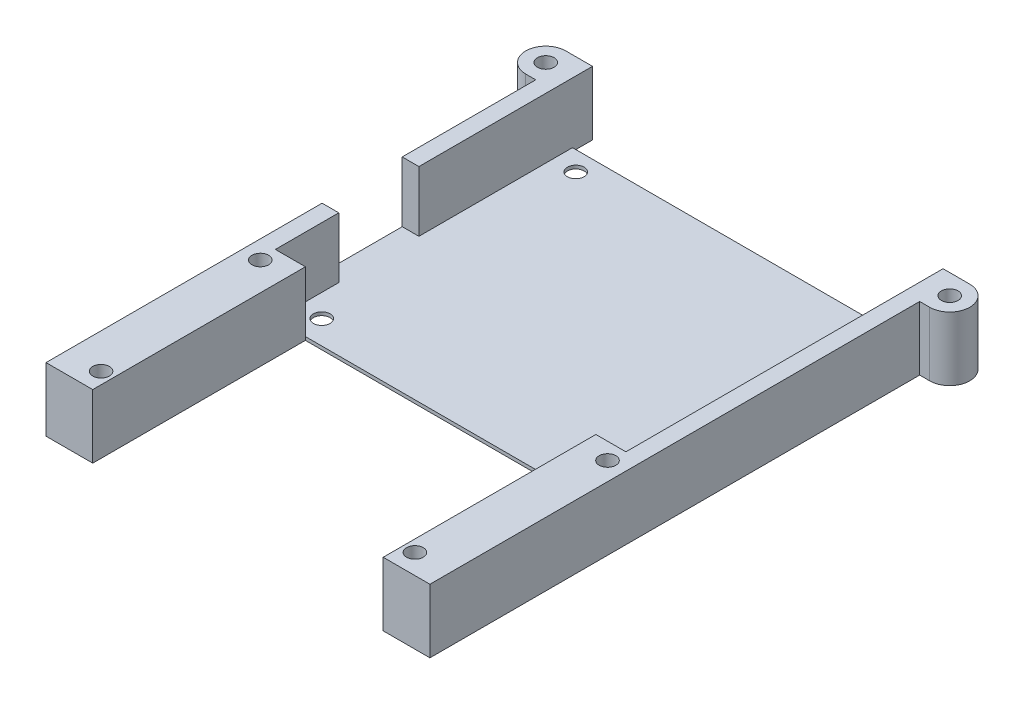
ISO-10303-21;
HEADER;
FILE_DESCRIPTION(('STEP AP214'),'2;1');
FILE_NAME('part.step','',(''),(''),'','','');
FILE_SCHEMA(('AUTOMOTIVE_DESIGN { 1 0 10303 214 1 1 1 1 }'));
ENDSEC;
DATA;
#1=APPLICATION_CONTEXT('core data for automotive mechanical design processes');
#2=APPLICATION_PROTOCOL_DEFINITION('international standard','automotive_design',2000,#1);
#3=PRODUCT_CONTEXT('',#1,'mechanical');
#4=PRODUCT('Part','Part','',(#3));
#5=PRODUCT_RELATED_PRODUCT_CATEGORY('part','',(#4));
#6=PRODUCT_DEFINITION_FORMATION('','',#4);
#7=PRODUCT_DEFINITION_CONTEXT('part definition',#1,'design');
#8=PRODUCT_DEFINITION('design','',#6,#7);
#9=PRODUCT_DEFINITION_SHAPE('','',#8);
#10=(LENGTH_UNIT() NAMED_UNIT(*) SI_UNIT(.MILLI.,.METRE.));
#11=(NAMED_UNIT(*) PLANE_ANGLE_UNIT() SI_UNIT($,.RADIAN.));
#12=(NAMED_UNIT(*) SI_UNIT($,.STERADIAN.) SOLID_ANGLE_UNIT());
#13=UNCERTAINTY_MEASURE_WITH_UNIT(LENGTH_MEASURE(1.E-05),#10,'distance_accuracy_value','');
#14=(GEOMETRIC_REPRESENTATION_CONTEXT(3) GLOBAL_UNCERTAINTY_ASSIGNED_CONTEXT((#13)) GLOBAL_UNIT_ASSIGNED_CONTEXT((#10,
#11,#12)) REPRESENTATION_CONTEXT('',''));
#15=CARTESIAN_POINT('',(0.,0.,0.));
#16=DIRECTION('',(0.,0.,1.));
#17=DIRECTION('',(1.,0.,0.));
#18=AXIS2_PLACEMENT_3D('',#15,#16,#17);
#19=CARTESIAN_POINT('',(0.,0.5,-31.85));
#20=DIRECTION('',(0.,0.,1.));
#21=DIRECTION('',(1.,0.,0.));
#22=AXIS2_PLACEMENT_3D('',#19,#20,#21);
#23=PLANE('',#22);
#24=DIRECTION('',(0.,-1.,0.));
#25=VECTOR('',#24,1.);
#26=CARTESIAN_POINT('',(21.75,9.55,-31.85));
#27=LINE('',#26,#25);
#28=CARTESIAN_POINT('',(21.75,0.5,-31.85));
#29=VERTEX_POINT('',#28);
#30=CARTESIAN_POINT('',(21.75,0.,-31.85));
#31=VERTEX_POINT('',#30);
#32=EDGE_CURVE('E335',#29,#31,#27,.T.);
#33=ORIENTED_EDGE('',*,*,#32,.F.);
#34=DIRECTION('',(-1.,0.,0.));
#35=VECTOR('',#34,1.);
#36=CARTESIAN_POINT('',(0.,0.5,-31.85));
#37=LINE('',#36,#35);
#38=CARTESIAN_POINT('',(-21.75,0.5,-31.85));
#39=VERTEX_POINT('',#38);
#40=EDGE_CURVE('E70',#29,#39,#37,.T.);
#41=ORIENTED_EDGE('',*,*,#40,.T.);
#42=DIRECTION('',(0.,-1.,0.));
#43=VECTOR('',#42,1.);
#44=CARTESIAN_POINT('',(-21.75,9.55,-31.85));
#45=LINE('',#44,#43);
#46=CARTESIAN_POINT('',(-21.75,0.,-31.85));
#47=VERTEX_POINT('',#46);
#48=EDGE_CURVE('E396',#39,#47,#45,.T.);
#49=ORIENTED_EDGE('',*,*,#48,.T.);
#50=DIRECTION('',(-1.,0.,0.));
#51=VECTOR('',#50,1.);
#52=CARTESIAN_POINT('',(0.,0.,-31.85));
#53=LINE('',#52,#51);
#54=EDGE_CURVE('E416',#31,#47,#53,.T.);
#55=ORIENTED_EDGE('',*,*,#54,.F.);
#56=EDGE_LOOP('',(#33,#41,#49,#55));
#57=FACE_BOUND('',#56,.T.);
#58=ADVANCED_FACE('F45',(#57),#23,.T.);
#59=CARTESIAN_POINT('',(0.,0.5,-76.35));
#60=DIRECTION('',(0.,0.,-1.));
#61=DIRECTION('',(-1.,0.,0.));
#62=AXIS2_PLACEMENT_3D('',#59,#60,#61);
#63=PLANE('',#62);
#64=DIRECTION('',(1.,0.,0.));
#65=VECTOR('',#64,1.);
#66=CARTESIAN_POINT('',(0.,0.,-76.35));
#67=LINE('',#66,#65);
#68=CARTESIAN_POINT('',(-26.25,0.,-76.35));
#69=VERTEX_POINT('',#68);
#70=CARTESIAN_POINT('',(26.25,0.,-76.35));
#71=VERTEX_POINT('',#70);
#72=EDGE_CURVE('E444',#69,#71,#67,.T.);
#73=ORIENTED_EDGE('',*,*,#72,.F.);
#74=DIRECTION('',(0.,-1.,0.));
#75=VECTOR('',#74,1.);
#76=CARTESIAN_POINT('',(-26.25,0.5,-76.35));
#77=LINE('',#76,#75);
#78=CARTESIAN_POINT('',(-26.25,0.5,-76.35));
#79=VERTEX_POINT('',#78);
#80=EDGE_CURVE('E54',#79,#69,#77,.T.);
#81=ORIENTED_EDGE('',*,*,#80,.F.);
#82=DIRECTION('',(1.,0.,0.));
#83=VECTOR('',#82,1.);
#84=CARTESIAN_POINT('',(0.,0.5,-76.35));
#85=LINE('',#84,#83);
#86=CARTESIAN_POINT('',(26.25,0.5,-76.35));
#87=VERTEX_POINT('',#86);
#88=EDGE_CURVE('E423',#79,#87,#85,.T.);
#89=ORIENTED_EDGE('',*,*,#88,.T.);
#90=DIRECTION('',(0.,-1.,0.));
#91=VECTOR('',#90,1.);
#92=CARTESIAN_POINT('',(26.25,0.5,-76.35));
#93=LINE('',#92,#91);
#94=EDGE_CURVE('E11',#87,#71,#93,.T.);
#95=ORIENTED_EDGE('',*,*,#94,.T.);
#96=EDGE_LOOP('',(#73,#81,#89,#95));
#97=FACE_BOUND('',#96,.T.);
#98=ADVANCED_FACE('F514',(#97),#63,.T.);
#99=CARTESIAN_POINT('',(-28.75,0.5,0.));
#100=DIRECTION('',(-1.,0.,0.));
#101=DIRECTION('',(0.,0.,1.));
#102=AXIS2_PLACEMENT_3D('',#99,#100,#101);
#103=PLANE('',#102);
#104=DIRECTION('',(0.,0.,-1.));
#105=VECTOR('',#104,1.);
#106=CARTESIAN_POINT('',(-28.75,0.,0.));
#107=LINE('',#106,#105);
#108=CARTESIAN_POINT('',(-28.75,0.,0.));
#109=VERTEX_POINT('',#108);
#110=CARTESIAN_POINT('',(-28.75,0.,-73.35));
#111=VERTEX_POINT('',#110);
#112=EDGE_CURVE('E448',#109,#111,#107,.T.);
#113=ORIENTED_EDGE('',*,*,#112,.F.);
#114=DIRECTION('',(0.,-1.,0.));
#115=VECTOR('',#114,1.);
#116=CARTESIAN_POINT('',(-28.75,9.55,0.));
#117=LINE('',#116,#115);
#118=CARTESIAN_POINT('',(-28.75,9.55,0.));
#119=VERTEX_POINT('',#118);
#120=EDGE_CURVE('E404',#119,#109,#117,.T.);
#121=ORIENTED_EDGE('',*,*,#120,.F.);
#122=DIRECTION('',(0.,0.,-1.));
#123=VECTOR('',#122,1.);
#124=CARTESIAN_POINT('',(-28.75,9.55,0.));
#125=LINE('',#124,#123);
#126=CARTESIAN_POINT('',(-28.75,9.55,-41.35));
#127=VERTEX_POINT('',#126);
#128=EDGE_CURVE('E361',#119,#127,#125,.T.);
#129=ORIENTED_EDGE('',*,*,#128,.T.);
#130=DIRECTION('',(0.,-1.,0.));
#131=VECTOR('',#130,1.);
#132=CARTESIAN_POINT('',(-28.75,9.55,-41.35));
#133=LINE('',#132,#131);
#134=CARTESIAN_POINT('',(-28.75,0.5,-41.35));
#135=VERTEX_POINT('',#134);
#136=EDGE_CURVE('E408',#127,#135,#133,.T.);
#137=ORIENTED_EDGE('',*,*,#136,.T.);
#138=DIRECTION('',(0.,0.,-1.));
#139=VECTOR('',#138,1.);
#140=CARTESIAN_POINT('',(-28.75,0.5,0.));
#141=LINE('',#140,#139);
#142=CARTESIAN_POINT('',(-28.75,0.5,-53.35));
#143=VERTEX_POINT('',#142);
#144=EDGE_CURVE('E435',#135,#143,#141,.T.);
#145=ORIENTED_EDGE('',*,*,#144,.T.);
#146=DIRECTION('',(0.,-1.,0.));
#147=VECTOR('',#146,1.);
#148=CARTESIAN_POINT('',(-28.75,9.55,-53.35));
#149=LINE('',#148,#147);
#150=CARTESIAN_POINT('',(-28.75,9.55,-53.35));
#151=VERTEX_POINT('',#150);
#152=EDGE_CURVE('E267',#151,#143,#149,.T.);
#153=ORIENTED_EDGE('',*,*,#152,.F.);
#154=DIRECTION('',(0.,0.,-1.));
#155=VECTOR('',#154,1.);
#156=CARTESIAN_POINT('',(-28.75,9.55,0.));
#157=LINE('',#156,#155);
#158=CARTESIAN_POINT('',(-28.75,9.55,-73.35));
#159=VERTEX_POINT('',#158);
#160=EDGE_CURVE('E235',#151,#159,#157,.T.);
#161=ORIENTED_EDGE('',*,*,#160,.T.);
#162=DIRECTION('',(0.,-1.,0.));
#163=VECTOR('',#162,1.);
#164=CARTESIAN_POINT('',(-28.75,9.55,-73.35));
#165=LINE('',#164,#163);
#166=EDGE_CURVE('E271',#159,#111,#165,.T.);
#167=ORIENTED_EDGE('',*,*,#166,.T.);
#168=EDGE_LOOP('',(#113,#121,#129,#137,#145,#153,#161,#167));
#169=FACE_BOUND('',#168,.T.);
#170=ADVANCED_FACE('F528',(#169),#103,.T.);
#171=CARTESIAN_POINT('',(0.,0.5,0.));
#172=DIRECTION('',(0.,1.,0.));
#173=DIRECTION('',(0.,0.,1.));
#174=AXIS2_PLACEMENT_3D('',#171,#172,#173);
#175=PLANE('',#174);
#176=CARTESIAN_POINT('',(22.85,0.5,-73.45));
#177=DIRECTION('',(0.,1.,0.));
#178=DIRECTION('',(0.,0.,1.));
#179=AXIS2_PLACEMENT_3D('',#176,#177,#178);
#180=CIRCLE('',#179,1.25);
#181=CARTESIAN_POINT('',(22.85,0.5,-72.2));
#182=VERTEX_POINT('',#181);
#183=EDGE_CURVE('E1044',#182,#182,#180,.T.);
#184=ORIENTED_EDGE('',*,*,#183,.F.);
#185=EDGE_LOOP('',(#184));
#186=FACE_BOUND('',#185,.T.);
#187=CARTESIAN_POINT('',(-22.85,0.5,-73.45));
#188=DIRECTION('',(0.,1.,0.));
#189=DIRECTION('',(0.,0.,1.));
#190=AXIS2_PLACEMENT_3D('',#187,#188,#189);
#191=CIRCLE('',#190,1.25);
#192=CARTESIAN_POINT('',(-22.85,0.5,-72.2));
#193=VERTEX_POINT('',#192);
#194=EDGE_CURVE('E1057',#193,#193,#191,.T.);
#195=ORIENTED_EDGE('',*,*,#194,.F.);
#196=EDGE_LOOP('',(#195));
#197=FACE_BOUND('',#196,.T.);
#198=CARTESIAN_POINT('',(-22.85,0.5,-35.4));
#199=DIRECTION('',(0.,1.,0.));
#200=DIRECTION('',(0.,0.,1.));
#201=AXIS2_PLACEMENT_3D('',#198,#199,#200);
#202=CIRCLE('',#201,1.25);
#203=CARTESIAN_POINT('',(-22.85,0.5,-34.15));
#204=VERTEX_POINT('',#203);
#205=EDGE_CURVE('E1069',#204,#204,#202,.T.);
#206=ORIENTED_EDGE('',*,*,#205,.F.);
#207=EDGE_LOOP('',(#206));
#208=FACE_BOUND('',#207,.T.);
#209=CARTESIAN_POINT('',(22.85,0.5,-35.4));
#210=DIRECTION('',(0.,1.,0.));
#211=DIRECTION('',(0.,0.,1.));
#212=AXIS2_PLACEMENT_3D('',#209,#210,#211);
#213=CIRCLE('',#212,1.25);
#214=CARTESIAN_POINT('',(22.85,0.5,-34.15));
#215=VERTEX_POINT('',#214);
#216=EDGE_CURVE('E483',#215,#215,#213,.T.);
#217=ORIENTED_EDGE('',*,*,#216,.F.);
#218=EDGE_LOOP('',(#217));
#219=FACE_BOUND('',#218,.T.);
#220=CARTESIAN_POINT('',(26.25,0.5,-31.85));
#221=VERTEX_POINT('',#220);
#222=EDGE_CURVE('E417',#221,#29,#37,.T.);
#223=ORIENTED_EDGE('',*,*,#222,.F.);
#224=DIRECTION('',(0.,0.,1.));
#225=VECTOR('',#224,1.);
#226=CARTESIAN_POINT('',(26.25,0.5,0.));
#227=LINE('',#226,#225);
#228=EDGE_CURVE('E420',#87,#221,#227,.T.);
#229=ORIENTED_EDGE('',*,*,#228,.F.);
#230=ORIENTED_EDGE('',*,*,#88,.F.);
#231=DIRECTION('',(0.,0.,1.));
#232=VECTOR('',#231,1.);
#233=CARTESIAN_POINT('',(-26.25,0.5,0.));
#234=LINE('',#233,#232);
#235=CARTESIAN_POINT('',(-26.25,0.5,-53.35));
#236=VERTEX_POINT('',#235);
#237=EDGE_CURVE('E427',#79,#236,#234,.T.);
#238=ORIENTED_EDGE('',*,*,#237,.T.);
#239=DIRECTION('',(1.,0.,0.));
#240=VECTOR('',#239,1.);
#241=CARTESIAN_POINT('',(0.,0.5,-53.35));
#242=LINE('',#241,#240);
#243=EDGE_CURVE('E430',#143,#236,#242,.T.);
#244=ORIENTED_EDGE('',*,*,#243,.F.);
#245=ORIENTED_EDGE('',*,*,#144,.F.);
#246=DIRECTION('',(1.,0.,0.));
#247=VECTOR('',#246,1.);
#248=CARTESIAN_POINT('',(0.,0.5,-41.35));
#249=LINE('',#248,#247);
#250=CARTESIAN_POINT('',(-26.25,0.5,-41.35));
#251=VERTEX_POINT('',#250);
#252=EDGE_CURVE('E439',#135,#251,#249,.T.);
#253=ORIENTED_EDGE('',*,*,#252,.T.);
#254=CARTESIAN_POINT('',(-26.25,0.5,-31.85));
#255=VERTEX_POINT('',#254);
#256=EDGE_CURVE('E431',#251,#255,#234,.T.);
#257=ORIENTED_EDGE('',*,*,#256,.T.);
#258=DIRECTION('',(-1.,0.,0.));
#259=VECTOR('',#258,1.);
#260=CARTESIAN_POINT('',(0.,0.5,-31.85));
#261=LINE('',#260,#259);
#262=EDGE_CURVE('E412',#39,#255,#261,.T.);
#263=ORIENTED_EDGE('',*,*,#262,.F.);
#264=ORIENTED_EDGE('',*,*,#40,.F.);
#265=EDGE_LOOP('',(#223,#229,#230,#238,#244,#245,#253,#257,#263,#264));
#266=FACE_BOUND('',#265,.T.);
#267=ADVANCED_FACE('F507',(#186,#197,#208,#219,#266),#175,.T.);
#268=CARTESIAN_POINT('',(0.,0.,0.));
#269=DIRECTION('',(0.,1.,0.));
#270=DIRECTION('',(0.,0.,1.));
#271=AXIS2_PLACEMENT_3D('',#268,#269,#270);
#272=PLANE('',#271);
#273=CARTESIAN_POINT('',(22.85,0.,-73.45));
#274=DIRECTION('',(0.,-1.,0.));
#275=DIRECTION('',(0.,0.,-1.));
#276=AXIS2_PLACEMENT_3D('',#273,#274,#275);
#277=CIRCLE('',#276,1.25);
#278=CARTESIAN_POINT('',(22.85,0.,-74.7));
#279=VERTEX_POINT('',#278);
#280=EDGE_CURVE('E1047',#279,#279,#277,.T.);
#281=ORIENTED_EDGE('',*,*,#280,.F.);
#282=EDGE_LOOP('',(#281));
#283=FACE_BOUND('',#282,.T.);
#284=CARTESIAN_POINT('',(-22.85,0.,-73.45));
#285=DIRECTION('',(0.,-1.,0.));
#286=DIRECTION('',(0.,0.,-1.));
#287=AXIS2_PLACEMENT_3D('',#284,#285,#286);
#288=CIRCLE('',#287,1.25);
#289=CARTESIAN_POINT('',(-22.85,0.,-74.7));
#290=VERTEX_POINT('',#289);
#291=EDGE_CURVE('E1051',#290,#290,#288,.T.);
#292=ORIENTED_EDGE('',*,*,#291,.F.);
#293=EDGE_LOOP('',(#292));
#294=FACE_BOUND('',#293,.T.);
#295=CARTESIAN_POINT('',(-26.,0.,-29.35));
#296=DIRECTION('',(0.,-1.,0.));
#297=DIRECTION('',(0.,0.,-1.));
#298=AXIS2_PLACEMENT_3D('',#295,#296,#297);
#299=CIRCLE('',#298,1.25);
#300=CARTESIAN_POINT('',(-26.,0.,-30.6));
#301=VERTEX_POINT('',#300);
#302=EDGE_CURVE('E1061',#301,#301,#299,.T.);
#303=ORIENTED_EDGE('',*,*,#302,.F.);
#304=EDGE_LOOP('',(#303));
#305=FACE_BOUND('',#304,.T.);
#306=CARTESIAN_POINT('',(-22.85,0.,-35.4));
#307=DIRECTION('',(0.,-1.,0.));
#308=DIRECTION('',(0.,0.,-1.));
#309=AXIS2_PLACEMENT_3D('',#306,#307,#308);
#310=CIRCLE('',#309,1.25);
#311=CARTESIAN_POINT('',(-22.85,0.,-36.65));
#312=VERTEX_POINT('',#311);
#313=EDGE_CURVE('E1065',#312,#312,#310,.T.);
#314=ORIENTED_EDGE('',*,*,#313,.F.);
#315=EDGE_LOOP('',(#314));
#316=FACE_BOUND('',#315,.T.);
#317=CARTESIAN_POINT('',(22.85,0.,-35.4));
#318=DIRECTION('',(0.,-1.,0.));
#319=DIRECTION('',(0.,0.,-1.));
#320=AXIS2_PLACEMENT_3D('',#317,#318,#319);
#321=CIRCLE('',#320,1.25);
#322=CARTESIAN_POINT('',(22.85,0.,-36.65));
#323=VERTEX_POINT('',#322);
#324=EDGE_CURVE('E489',#323,#323,#321,.T.);
#325=ORIENTED_EDGE('',*,*,#324,.F.);
#326=EDGE_LOOP('',(#325));
#327=FACE_BOUND('',#326,.T.);
#328=CARTESIAN_POINT('',(26.,0.,-29.35));
#329=DIRECTION('',(0.,-1.,0.));
#330=DIRECTION('',(0.,0.,-1.));
#331=AXIS2_PLACEMENT_3D('',#328,#329,#330);
#332=CIRCLE('',#331,1.25);
#333=CARTESIAN_POINT('',(26.,0.,-30.6));
#334=VERTEX_POINT('',#333);
#335=EDGE_CURVE('E475',#334,#334,#332,.T.);
#336=ORIENTED_EDGE('',*,*,#335,.F.);
#337=EDGE_LOOP('',(#336));
#338=FACE_BOUND('',#337,.T.);
#339=CARTESIAN_POINT('',(23.5,0.,-3.));
#340=DIRECTION('',(0.,-1.,0.));
#341=DIRECTION('',(0.,0.,-1.));
#342=AXIS2_PLACEMENT_3D('',#339,#340,#341);
#343=CIRCLE('',#342,1.25);
#344=CARTESIAN_POINT('',(23.5,0.,-4.25));
#345=VERTEX_POINT('',#344);
#346=EDGE_CURVE('E471',#345,#345,#343,.T.);
#347=ORIENTED_EDGE('',*,*,#346,.F.);
#348=EDGE_LOOP('',(#347));
#349=FACE_BOUND('',#348,.T.);
#350=CARTESIAN_POINT('',(-23.5,0.,-3.));
#351=DIRECTION('',(0.,-1.,0.));
#352=DIRECTION('',(0.,0.,-1.));
#353=AXIS2_PLACEMENT_3D('',#350,#351,#352);
#354=CIRCLE('',#353,1.25);
#355=CARTESIAN_POINT('',(-23.5,0.,-4.25));
#356=VERTEX_POINT('',#355);
#357=EDGE_CURVE('E467',#356,#356,#354,.T.);
#358=ORIENTED_EDGE('',*,*,#357,.F.);
#359=EDGE_LOOP('',(#358));
#360=FACE_BOUND('',#359,.T.);
#361=CARTESIAN_POINT('',(30.25,0.,-76.35));
#362=DIRECTION('',(0.,-1.,0.));
#363=DIRECTION('',(0.,0.,-1.));
#364=AXIS2_PLACEMENT_3D('',#361,#362,#363);
#365=CIRCLE('',#364,1.25);
#366=CARTESIAN_POINT('',(30.25,0.,-77.6));
#367=VERTEX_POINT('',#366);
#368=EDGE_CURVE('E462',#367,#367,#365,.T.);
#369=ORIENTED_EDGE('',*,*,#368,.F.);
#370=EDGE_LOOP('',(#369));
#371=FACE_BOUND('',#370,.T.);
#372=CARTESIAN_POINT('',(-30.25,0.,-76.35));
#373=DIRECTION('',(0.,-1.,0.));
#374=DIRECTION('',(0.,0.,-1.));
#375=AXIS2_PLACEMENT_3D('',#372,#373,#374);
#376=CIRCLE('',#375,1.25);
#377=CARTESIAN_POINT('',(-30.25,0.,-77.6));
#378=VERTEX_POINT('',#377);
#379=EDGE_CURVE('E457',#378,#378,#376,.T.);
#380=ORIENTED_EDGE('',*,*,#379,.F.);
#381=EDGE_LOOP('',(#380));
#382=FACE_BOUND('',#381,.T.);
#383=ORIENTED_EDGE('',*,*,#72,.T.);
#384=DIRECTION('',(0.,0.,1.));
#385=VECTOR('',#384,1.);
#386=CARTESIAN_POINT('',(26.25,0.,0.));
#387=LINE('',#386,#385);
#388=CARTESIAN_POINT('',(26.25,0.,-79.35));
#389=VERTEX_POINT('',#388);
#390=EDGE_CURVE('E323',#389,#71,#387,.T.);
#391=ORIENTED_EDGE('',*,*,#390,.F.);
#392=DIRECTION('',(1.,0.,0.));
#393=VECTOR('',#392,1.);
#394=CARTESIAN_POINT('',(0.,0.,-79.35));
#395=LINE('',#394,#393);
#396=CARTESIAN_POINT('',(30.25,0.,-79.35));
#397=VERTEX_POINT('',#396);
#398=EDGE_CURVE('E319',#389,#397,#395,.T.);
#399=ORIENTED_EDGE('',*,*,#398,.T.);
#400=CARTESIAN_POINT('',(30.25,0.,-76.35));
#401=DIRECTION('',(0.,1.,0.));
#402=DIRECTION('',(0.,0.,1.));
#403=AXIS2_PLACEMENT_3D('',#400,#401,#402);
#404=CIRCLE('',#403,3.00000000000001);
#405=CARTESIAN_POINT('',(30.25,0.,-73.35));
#406=VERTEX_POINT('',#405);
#407=EDGE_CURVE('E315',#406,#397,#404,.T.);
#408=ORIENTED_EDGE('',*,*,#407,.F.);
#409=DIRECTION('',(-1.,0.,0.));
#410=VECTOR('',#409,1.);
#411=CARTESIAN_POINT('',(0.,0.,-73.35));
#412=LINE('',#411,#410);
#413=CARTESIAN_POINT('',(28.75,0.,-73.35));
#414=VERTEX_POINT('',#413);
#415=EDGE_CURVE('E311',#406,#414,#412,.T.);
#416=ORIENTED_EDGE('',*,*,#415,.T.);
#417=DIRECTION('',(0.,0.,1.));
#418=VECTOR('',#417,1.);
#419=CARTESIAN_POINT('',(28.75,0.,0.));
#420=LINE('',#419,#418);
#421=CARTESIAN_POINT('',(28.75,0.,0.));
#422=VERTEX_POINT('',#421);
#423=EDGE_CURVE('E217',#414,#422,#420,.T.);
#424=ORIENTED_EDGE('',*,*,#423,.T.);
#425=DIRECTION('',(-1.,0.,0.));
#426=VECTOR('',#425,1.);
#427=CARTESIAN_POINT('',(0.,0.,0.));
#428=LINE('',#427,#426);
#429=CARTESIAN_POINT('',(21.75,0.,0.));
#430=VERTEX_POINT('',#429);
#431=EDGE_CURVE('E282',#422,#430,#428,.T.);
#432=ORIENTED_EDGE('',*,*,#431,.T.);
#433=DIRECTION('',(0.,0.,-1.));
#434=VECTOR('',#433,1.);
#435=CARTESIAN_POINT('',(21.75,0.,0.));
#436=LINE('',#435,#434);
#437=EDGE_CURVE('E62',#430,#31,#436,.T.);
#438=ORIENTED_EDGE('',*,*,#437,.T.);
#439=ORIENTED_EDGE('',*,*,#54,.T.);
#440=DIRECTION('',(0.,0.,1.));
#441=VECTOR('',#440,1.);
#442=CARTESIAN_POINT('',(-21.75,0.,0.));
#443=LINE('',#442,#441);
#444=CARTESIAN_POINT('',(-21.75,0.,0.));
#445=VERTEX_POINT('',#444);
#446=EDGE_CURVE('E362',#47,#445,#443,.T.);
#447=ORIENTED_EDGE('',*,*,#446,.T.);
#448=DIRECTION('',(-1.,0.,0.));
#449=VECTOR('',#448,1.);
#450=CARTESIAN_POINT('',(0.,0.,0.));
#451=LINE('',#450,#449);
#452=EDGE_CURVE('E356',#445,#109,#451,.T.);
#453=ORIENTED_EDGE('',*,*,#452,.T.);
#454=ORIENTED_EDGE('',*,*,#112,.T.);
#455=DIRECTION('',(1.,0.,0.));
#456=VECTOR('',#455,1.);
#457=CARTESIAN_POINT('',(0.,0.,-73.35));
#458=LINE('',#457,#456);
#459=CARTESIAN_POINT('',(-30.25,0.,-73.35));
#460=VERTEX_POINT('',#459);
#461=EDGE_CURVE('E254',#460,#111,#458,.T.);
#462=ORIENTED_EDGE('',*,*,#461,.F.);
#463=CARTESIAN_POINT('',(-30.25,0.,-76.35));
#464=DIRECTION('',(0.,1.,0.));
#465=DIRECTION('',(0.,0.,1.));
#466=AXIS2_PLACEMENT_3D('',#463,#464,#465);
#467=CIRCLE('',#466,3.00000000000001);
#468=CARTESIAN_POINT('',(-30.25,0.,-79.35));
#469=VERTEX_POINT('',#468);
#470=EDGE_CURVE('E250',#460,#469,#467,.F.);
#471=ORIENTED_EDGE('',*,*,#470,.T.);
#472=DIRECTION('',(1.,0.,0.));
#473=VECTOR('',#472,1.);
#474=CARTESIAN_POINT('',(0.,0.,-79.35));
#475=LINE('',#474,#473);
#476=CARTESIAN_POINT('',(-26.25,0.,-79.35));
#477=VERTEX_POINT('',#476);
#478=EDGE_CURVE('E211',#469,#477,#475,.T.);
#479=ORIENTED_EDGE('',*,*,#478,.T.);
#480=DIRECTION('',(0.,0.,1.));
#481=VECTOR('',#480,1.);
#482=CARTESIAN_POINT('',(-26.25,0.,0.));
#483=LINE('',#482,#481);
#484=EDGE_CURVE('E227',#477,#69,#483,.T.);
#485=ORIENTED_EDGE('',*,*,#484,.T.);
#486=EDGE_LOOP('',(#383,#391,#399,#408,#416,#424,#432,#438,#439,#447,#453,#454,#462,#471,#479,#485));
#487=FACE_BOUND('',#486,.T.);
#488=ADVANCED_FACE('F504',(#283,#294,#305,#316,#327,#338,#349,#360,#371,#382,#487),#272,.F.);
#489=CARTESIAN_POINT('',(0.,9.55,-41.35));
#490=DIRECTION('',(0.,0.,-1.));
#491=DIRECTION('',(-1.,0.,0.));
#492=AXIS2_PLACEMENT_3D('',#489,#490,#491);
#493=PLANE('',#492);
#494=DIRECTION('',(0.,-1.,0.));
#495=VECTOR('',#494,1.);
#496=CARTESIAN_POINT('',(-26.25,9.55,-41.35));
#497=LINE('',#496,#495);
#498=CARTESIAN_POINT('',(-26.25,9.55,-41.35));
#499=VERTEX_POINT('',#498);
#500=EDGE_CURVE('E382',#499,#251,#497,.T.);
#501=ORIENTED_EDGE('',*,*,#500,.T.);
#502=ORIENTED_EDGE('',*,*,#252,.F.);
#503=ORIENTED_EDGE('',*,*,#136,.F.);
#504=DIRECTION('',(1.,0.,0.));
#505=VECTOR('',#504,1.);
#506=CARTESIAN_POINT('',(0.,9.55,-41.35));
#507=LINE('',#506,#505);
#508=EDGE_CURVE('E357',#127,#499,#507,.T.);
#509=ORIENTED_EDGE('',*,*,#508,.T.);
#510=EDGE_LOOP('',(#501,#502,#503,#509));
#511=FACE_BOUND('',#510,.T.);
#512=ADVANCED_FACE('F506',(#511),#493,.T.);
#513=CARTESIAN_POINT('',(0.,9.55,0.));
#514=DIRECTION('',(0.,0.,1.));
#515=DIRECTION('',(1.,0.,0.));
#516=AXIS2_PLACEMENT_3D('',#513,#514,#515);
#517=PLANE('',#516);
#518=ORIENTED_EDGE('',*,*,#452,.F.);
#519=DIRECTION('',(0.,-1.,0.));
#520=VECTOR('',#519,1.);
#521=CARTESIAN_POINT('',(-21.75,9.55,0.));
#522=LINE('',#521,#520);
#523=CARTESIAN_POINT('',(-21.75,9.55,0.));
#524=VERTEX_POINT('',#523);
#525=EDGE_CURVE('E401',#524,#445,#522,.T.);
#526=ORIENTED_EDGE('',*,*,#525,.F.);
#527=DIRECTION('',(-1.,0.,0.));
#528=VECTOR('',#527,1.);
#529=CARTESIAN_POINT('',(0.,9.55,0.));
#530=LINE('',#529,#528);
#531=EDGE_CURVE('E366',#524,#119,#530,.T.);
#532=ORIENTED_EDGE('',*,*,#531,.T.);
#533=ORIENTED_EDGE('',*,*,#120,.T.);
#534=EDGE_LOOP('',(#518,#526,#532,#533));
#535=FACE_BOUND('',#534,.T.);
#536=ADVANCED_FACE('F552',(#535),#517,.T.);
#537=CARTESIAN_POINT('',(-21.75,9.55,0.));
#538=DIRECTION('',(1.,0.,0.));
#539=DIRECTION('',(0.,0.,-1.));
#540=AXIS2_PLACEMENT_3D('',#537,#538,#539);
#541=PLANE('',#540);
#542=ORIENTED_EDGE('',*,*,#446,.F.);
#543=ORIENTED_EDGE('',*,*,#48,.F.);
#544=CARTESIAN_POINT('',(-21.75,9.55,-31.85));
#545=VERTEX_POINT('',#544);
#546=EDGE_CURVE('E397',#545,#39,#45,.T.);
#547=ORIENTED_EDGE('',*,*,#546,.F.);
#548=DIRECTION('',(0.,0.,1.));
#549=VECTOR('',#548,1.);
#550=CARTESIAN_POINT('',(-21.75,9.55,0.));
#551=LINE('',#550,#549);
#552=EDGE_CURVE('E370',#545,#524,#551,.T.);
#553=ORIENTED_EDGE('',*,*,#552,.T.);
#554=ORIENTED_EDGE('',*,*,#525,.T.);
#555=EDGE_LOOP('',(#542,#543,#547,#553,#554));
#556=FACE_BOUND('',#555,.T.);
#557=ADVANCED_FACE('F548',(#556),#541,.T.);
#558=CARTESIAN_POINT('',(0.,9.55,-31.85));
#559=DIRECTION('',(0.,0.,-1.));
#560=DIRECTION('',(-1.,0.,0.));
#561=AXIS2_PLACEMENT_3D('',#558,#559,#560);
#562=PLANE('',#561);
#563=ORIENTED_EDGE('',*,*,#546,.T.);
#564=ORIENTED_EDGE('',*,*,#262,.T.);
#565=DIRECTION('',(0.,-1.,0.));
#566=VECTOR('',#565,1.);
#567=CARTESIAN_POINT('',(-26.25,9.55,-31.85));
#568=LINE('',#567,#566);
#569=CARTESIAN_POINT('',(-26.25,9.55,-31.85));
#570=VERTEX_POINT('',#569);
#571=EDGE_CURVE('E392',#570,#255,#568,.T.);
#572=ORIENTED_EDGE('',*,*,#571,.F.);
#573=DIRECTION('',(1.,0.,0.));
#574=VECTOR('',#573,1.);
#575=CARTESIAN_POINT('',(0.,9.55,-31.85));
#576=LINE('',#575,#574);
#577=EDGE_CURVE('E374',#570,#545,#576,.T.);
#578=ORIENTED_EDGE('',*,*,#577,.T.);
#579=EDGE_LOOP('',(#563,#564,#572,#578));
#580=FACE_BOUND('',#579,.T.);
#581=ADVANCED_FACE('F558',(#580),#562,.T.);
#582=CARTESIAN_POINT('',(-26.25,9.55,0.));
#583=DIRECTION('',(1.,0.,0.));
#584=DIRECTION('',(0.,0.,-1.));
#585=AXIS2_PLACEMENT_3D('',#582,#583,#584);
#586=PLANE('',#585);
#587=ORIENTED_EDGE('',*,*,#571,.T.);
#588=ORIENTED_EDGE('',*,*,#256,.F.);
#589=ORIENTED_EDGE('',*,*,#500,.F.);
#590=DIRECTION('',(0.,0.,1.));
#591=VECTOR('',#590,1.);
#592=CARTESIAN_POINT('',(-26.25,9.55,0.));
#593=LINE('',#592,#591);
#594=EDGE_CURVE('E378',#499,#570,#593,.T.);
#595=ORIENTED_EDGE('',*,*,#594,.T.);
#596=EDGE_LOOP('',(#587,#588,#589,#595));
#597=FACE_BOUND('',#596,.T.);
#598=ADVANCED_FACE('F535',(#597),#586,.T.);
#599=CARTESIAN_POINT('',(0.,9.55,0.));
#600=DIRECTION('',(0.,1.,0.));
#601=DIRECTION('',(0.,0.,1.));
#602=AXIS2_PLACEMENT_3D('',#599,#600,#601);
#603=PLANE('',#602);
#604=CARTESIAN_POINT('',(-26.,9.55,-29.35));
#605=DIRECTION('',(0.,1.,0.));
#606=DIRECTION('',(0.,0.,1.));
#607=AXIS2_PLACEMENT_3D('',#604,#605,#606);
#608=CIRCLE('',#607,1.25);
#609=CARTESIAN_POINT('',(-26.,9.55,-28.1));
#610=VERTEX_POINT('',#609);
#611=EDGE_CURVE('E48',#610,#610,#608,.T.);
#612=ORIENTED_EDGE('',*,*,#611,.F.);
#613=EDGE_LOOP('',(#612));
#614=FACE_BOUND('',#613,.T.);
#615=CARTESIAN_POINT('',(-23.5,9.55,-3.));
#616=DIRECTION('',(0.,1.,0.));
#617=DIRECTION('',(0.,0.,1.));
#618=AXIS2_PLACEMENT_3D('',#615,#616,#617);
#619=CIRCLE('',#618,1.25);
#620=CARTESIAN_POINT('',(-23.5,9.55,-1.75));
#621=VERTEX_POINT('',#620);
#622=EDGE_CURVE('E463',#621,#621,#619,.T.);
#623=ORIENTED_EDGE('',*,*,#622,.F.);
#624=EDGE_LOOP('',(#623));
#625=FACE_BOUND('',#624,.T.);
#626=ORIENTED_EDGE('',*,*,#508,.F.);
#627=ORIENTED_EDGE('',*,*,#128,.F.);
#628=ORIENTED_EDGE('',*,*,#531,.F.);
#629=ORIENTED_EDGE('',*,*,#552,.F.);
#630=ORIENTED_EDGE('',*,*,#577,.F.);
#631=ORIENTED_EDGE('',*,*,#594,.F.);
#632=EDGE_LOOP('',(#626,#627,#628,#629,#630,#631));
#633=FACE_BOUND('',#632,.T.);
#634=ADVANCED_FACE('F555',(#614,#625,#633),#603,.T.);
#635=CARTESIAN_POINT('',(28.75,9.55,0.));
#636=DIRECTION('',(1.,0.,0.));
#637=DIRECTION('',(0.,0.,-1.));
#638=AXIS2_PLACEMENT_3D('',#635,#636,#637);
#639=PLANE('',#638);
#640=ORIENTED_EDGE('',*,*,#423,.F.);
#641=DIRECTION('',(0.,-1.,0.));
#642=VECTOR('',#641,1.);
#643=CARTESIAN_POINT('',(28.75,9.55,-73.35));
#644=LINE('',#643,#642);
#645=CARTESIAN_POINT('',(28.75,9.55,-73.35));
#646=VERTEX_POINT('',#645);
#647=EDGE_CURVE('E353',#646,#414,#644,.T.);
#648=ORIENTED_EDGE('',*,*,#647,.F.);
#649=DIRECTION('',(0.,0.,1.));
#650=VECTOR('',#649,1.);
#651=CARTESIAN_POINT('',(28.75,9.55,0.));
#652=LINE('',#651,#650);
#653=CARTESIAN_POINT('',(28.75,9.55,0.));
#654=VERTEX_POINT('',#653);
#655=EDGE_CURVE('E277',#646,#654,#652,.T.);
#656=ORIENTED_EDGE('',*,*,#655,.T.);
#657=DIRECTION('',(0.,-1.,0.));
#658=VECTOR('',#657,1.);
#659=CARTESIAN_POINT('',(28.75,9.55,0.));
#660=LINE('',#659,#658);
#661=EDGE_CURVE('E307',#654,#422,#660,.T.);
#662=ORIENTED_EDGE('',*,*,#661,.T.);
#663=EDGE_LOOP('',(#640,#648,#656,#662));
#664=FACE_BOUND('',#663,.T.);
#665=ADVANCED_FACE('F580',(#664),#639,.T.);
#666=CARTESIAN_POINT('',(0.,9.55,-73.35));
#667=DIRECTION('',(0.,0.,1.));
#668=DIRECTION('',(1.,0.,0.));
#669=AXIS2_PLACEMENT_3D('',#666,#667,#668);
#670=PLANE('',#669);
#671=ORIENTED_EDGE('',*,*,#415,.F.);
#672=DIRECTION('',(0.,-1.,0.));
#673=VECTOR('',#672,1.);
#674=CARTESIAN_POINT('',(30.25,9.55,-73.35));
#675=LINE('',#674,#673);
#676=CARTESIAN_POINT('',(30.25,9.55,-73.35));
#677=VERTEX_POINT('',#676);
#678=EDGE_CURVE('E350',#677,#406,#675,.T.);
#679=ORIENTED_EDGE('',*,*,#678,.F.);
#680=DIRECTION('',(-1.,0.,0.));
#681=VECTOR('',#680,1.);
#682=CARTESIAN_POINT('',(0.,9.55,-73.35));
#683=LINE('',#682,#681);
#684=EDGE_CURVE('E281',#677,#646,#683,.T.);
#685=ORIENTED_EDGE('',*,*,#684,.T.);
#686=ORIENTED_EDGE('',*,*,#647,.T.);
#687=EDGE_LOOP('',(#671,#679,#685,#686));
#688=FACE_BOUND('',#687,.T.);
#689=ADVANCED_FACE('F574',(#688),#670,.T.);
#690=CARTESIAN_POINT('',(30.25,9.55,-76.35));
#691=DIRECTION('',(0.,-1.,0.));
#692=DIRECTION('',(0.,0.,-1.));
#693=AXIS2_PLACEMENT_3D('',#690,#691,#692);
#694=CYLINDRICAL_SURFACE('',#693,3.00000000000001);
#695=ORIENTED_EDGE('',*,*,#407,.T.);
#696=DIRECTION('',(0.,-1.,0.));
#697=VECTOR('',#696,1.);
#698=CARTESIAN_POINT('',(30.25,9.55,-79.35));
#699=LINE('',#698,#697);
#700=CARTESIAN_POINT('',(30.25,9.55,-79.35));
#701=VERTEX_POINT('',#700);
#702=EDGE_CURVE('E347',#701,#397,#699,.T.);
#703=ORIENTED_EDGE('',*,*,#702,.F.);
#704=CARTESIAN_POINT('',(30.25,9.55,-76.35));
#705=DIRECTION('',(0.,1.,0.));
#706=DIRECTION('',(0.,0.,1.));
#707=AXIS2_PLACEMENT_3D('',#704,#705,#706);
#708=CIRCLE('',#707,3.00000000000001);
#709=EDGE_CURVE('E286',#677,#701,#708,.T.);
#710=ORIENTED_EDGE('',*,*,#709,.F.);
#711=ORIENTED_EDGE('',*,*,#678,.T.);
#712=EDGE_LOOP('',(#695,#703,#710,#711));
#713=FACE_BOUND('',#712,.T.);
#714=ADVANCED_FACE('F588',(#713),#694,.T.);
#715=CARTESIAN_POINT('',(0.,9.55,-79.35));
#716=DIRECTION('',(0.,0.,-1.));
#717=DIRECTION('',(-1.,0.,0.));
#718=AXIS2_PLACEMENT_3D('',#715,#716,#717);
#719=PLANE('',#718);
#720=ORIENTED_EDGE('',*,*,#398,.F.);
#721=DIRECTION('',(0.,-1.,0.));
#722=VECTOR('',#721,1.);
#723=CARTESIAN_POINT('',(26.25,9.55,-79.35));
#724=LINE('',#723,#722);
#725=CARTESIAN_POINT('',(26.25,9.55,-79.35));
#726=VERTEX_POINT('',#725);
#727=EDGE_CURVE('E344',#726,#389,#724,.T.);
#728=ORIENTED_EDGE('',*,*,#727,.F.);
#729=DIRECTION('',(1.,0.,0.));
#730=VECTOR('',#729,1.);
#731=CARTESIAN_POINT('',(0.,9.55,-79.35));
#732=LINE('',#731,#730);
#733=EDGE_CURVE('E289',#726,#701,#732,.T.);
#734=ORIENTED_EDGE('',*,*,#733,.T.);
#735=ORIENTED_EDGE('',*,*,#702,.T.);
#736=EDGE_LOOP('',(#720,#728,#734,#735));
#737=FACE_BOUND('',#736,.T.);
#738=ADVANCED_FACE('F568',(#737),#719,.T.);
#739=CARTESIAN_POINT('',(26.25,9.55,0.));
#740=DIRECTION('',(1.,0.,0.));
#741=DIRECTION('',(0.,0.,-1.));
#742=AXIS2_PLACEMENT_3D('',#739,#740,#741);
#743=PLANE('',#742);
#744=ORIENTED_EDGE('',*,*,#94,.F.);
#745=ORIENTED_EDGE('',*,*,#228,.T.);
#746=DIRECTION('',(0.,-1.,0.));
#747=VECTOR('',#746,1.);
#748=CARTESIAN_POINT('',(26.25,9.55,-31.85));
#749=LINE('',#748,#747);
#750=CARTESIAN_POINT('',(26.25,9.55,-31.85));
#751=VERTEX_POINT('',#750);
#752=EDGE_CURVE('E340',#751,#221,#749,.T.);
#753=ORIENTED_EDGE('',*,*,#752,.F.);
#754=DIRECTION('',(0.,0.,1.));
#755=VECTOR('',#754,1.);
#756=CARTESIAN_POINT('',(26.25,9.55,0.));
#757=LINE('',#756,#755);
#758=EDGE_CURVE('E293',#726,#751,#757,.T.);
#759=ORIENTED_EDGE('',*,*,#758,.F.);
#760=ORIENTED_EDGE('',*,*,#727,.T.);
#761=ORIENTED_EDGE('',*,*,#390,.T.);
#762=EDGE_LOOP('',(#744,#745,#753,#759,#760,#761));
#763=FACE_BOUND('',#762,.T.);
#764=ADVANCED_FACE('F565',(#763),#743,.F.);
#765=CARTESIAN_POINT('',(0.,9.55,-31.85));
#766=DIRECTION('',(0.,0.,1.));
#767=DIRECTION('',(1.,0.,0.));
#768=AXIS2_PLACEMENT_3D('',#765,#766,#767);
#769=PLANE('',#768);
#770=ORIENTED_EDGE('',*,*,#222,.T.);
#771=CARTESIAN_POINT('',(21.75,9.55,-31.85));
#772=VERTEX_POINT('',#771);
#773=EDGE_CURVE('E336',#772,#29,#27,.T.);
#774=ORIENTED_EDGE('',*,*,#773,.F.);
#775=DIRECTION('',(-1.,0.,0.));
#776=VECTOR('',#775,1.);
#777=CARTESIAN_POINT('',(0.,9.55,-31.85));
#778=LINE('',#777,#776);
#779=EDGE_CURVE('E296',#751,#772,#778,.T.);
#780=ORIENTED_EDGE('',*,*,#779,.F.);
#781=ORIENTED_EDGE('',*,*,#752,.T.);
#782=EDGE_LOOP('',(#770,#774,#780,#781));
#783=FACE_BOUND('',#782,.T.);
#784=ADVANCED_FACE('F560',(#783),#769,.F.);
#785=CARTESIAN_POINT('',(21.75,9.55,0.));
#786=DIRECTION('',(-1.,0.,0.));
#787=DIRECTION('',(0.,0.,1.));
#788=AXIS2_PLACEMENT_3D('',#785,#786,#787);
#789=PLANE('',#788);
#790=ORIENTED_EDGE('',*,*,#437,.F.);
#791=DIRECTION('',(0.,-1.,0.));
#792=VECTOR('',#791,1.);
#793=CARTESIAN_POINT('',(21.75,9.55,0.));
#794=LINE('',#793,#792);
#795=CARTESIAN_POINT('',(21.75,9.55,0.));
#796=VERTEX_POINT('',#795);
#797=EDGE_CURVE('E332',#796,#430,#794,.T.);
#798=ORIENTED_EDGE('',*,*,#797,.F.);
#799=DIRECTION('',(0.,0.,-1.));
#800=VECTOR('',#799,1.);
#801=CARTESIAN_POINT('',(21.75,9.55,0.));
#802=LINE('',#801,#800);
#803=EDGE_CURVE('E299',#796,#772,#802,.T.);
#804=ORIENTED_EDGE('',*,*,#803,.T.);
#805=ORIENTED_EDGE('',*,*,#773,.T.);
#806=ORIENTED_EDGE('',*,*,#32,.T.);
#807=EDGE_LOOP('',(#790,#798,#804,#805,#806));
#808=FACE_BOUND('',#807,.T.);
#809=ADVANCED_FACE('F542',(#808),#789,.T.);
#810=CARTESIAN_POINT('',(0.,9.55,0.));
#811=DIRECTION('',(0.,0.,1.));
#812=DIRECTION('',(1.,0.,0.));
#813=AXIS2_PLACEMENT_3D('',#810,#811,#812);
#814=PLANE('',#813);
#815=ORIENTED_EDGE('',*,*,#431,.F.);
#816=ORIENTED_EDGE('',*,*,#661,.F.);
#817=DIRECTION('',(-1.,0.,0.));
#818=VECTOR('',#817,1.);
#819=CARTESIAN_POINT('',(0.,9.55,0.));
#820=LINE('',#819,#818);
#821=EDGE_CURVE('E303',#654,#796,#820,.T.);
#822=ORIENTED_EDGE('',*,*,#821,.T.);
#823=ORIENTED_EDGE('',*,*,#797,.T.);
#824=EDGE_LOOP('',(#815,#816,#822,#823));
#825=FACE_BOUND('',#824,.T.);
#826=ADVANCED_FACE('F583',(#825),#814,.T.);
#827=CARTESIAN_POINT('',(0.,9.55,0.));
#828=DIRECTION('',(0.,1.,0.));
#829=DIRECTION('',(0.,0.,1.));
#830=AXIS2_PLACEMENT_3D('',#827,#828,#829);
#831=PLANE('',#830);
#832=CARTESIAN_POINT('',(26.,9.55,-29.35));
#833=DIRECTION('',(0.,1.,0.));
#834=DIRECTION('',(0.,0.,1.));
#835=AXIS2_PLACEMENT_3D('',#832,#833,#834);
#836=CIRCLE('',#835,1.25);
#837=CARTESIAN_POINT('',(26.,9.55,-28.1));
#838=VERTEX_POINT('',#837);
#839=EDGE_CURVE('E472',#838,#838,#836,.T.);
#840=ORIENTED_EDGE('',*,*,#839,.F.);
#841=EDGE_LOOP('',(#840));
#842=FACE_BOUND('',#841,.T.);
#843=CARTESIAN_POINT('',(23.5,9.55,-3.));
#844=DIRECTION('',(0.,1.,0.));
#845=DIRECTION('',(0.,0.,1.));
#846=AXIS2_PLACEMENT_3D('',#843,#844,#845);
#847=CIRCLE('',#846,1.25);
#848=CARTESIAN_POINT('',(23.5,9.55,-1.75));
#849=VERTEX_POINT('',#848);
#850=EDGE_CURVE('E468',#849,#849,#847,.T.);
#851=ORIENTED_EDGE('',*,*,#850,.F.);
#852=EDGE_LOOP('',(#851));
#853=FACE_BOUND('',#852,.T.);
#854=CARTESIAN_POINT('',(30.25,9.55,-76.35));
#855=DIRECTION('',(0.,1.,0.));
#856=DIRECTION('',(0.,0.,1.));
#857=AXIS2_PLACEMENT_3D('',#854,#855,#856);
#858=CIRCLE('',#857,1.25);
#859=CARTESIAN_POINT('',(30.25,9.55,-75.1));
#860=VERTEX_POINT('',#859);
#861=EDGE_CURVE('E458',#860,#860,#858,.T.);
#862=ORIENTED_EDGE('',*,*,#861,.F.);
#863=EDGE_LOOP('',(#862));
#864=FACE_BOUND('',#863,.T.);
#865=ORIENTED_EDGE('',*,*,#655,.F.);
#866=ORIENTED_EDGE('',*,*,#684,.F.);
#867=ORIENTED_EDGE('',*,*,#709,.T.);
#868=ORIENTED_EDGE('',*,*,#733,.F.);
#869=ORIENTED_EDGE('',*,*,#758,.T.);
#870=ORIENTED_EDGE('',*,*,#779,.T.);
#871=ORIENTED_EDGE('',*,*,#803,.F.);
#872=ORIENTED_EDGE('',*,*,#821,.F.);
#873=EDGE_LOOP('',(#865,#866,#867,#868,#869,#870,#871,#872));
#874=FACE_BOUND('',#873,.T.);
#875=ADVANCED_FACE('F587',(#842,#853,#864,#874),#831,.T.);
#876=CARTESIAN_POINT('',(0.,9.55,-79.35));
#877=DIRECTION('',(0.,0.,-1.));
#878=DIRECTION('',(-1.,0.,0.));
#879=AXIS2_PLACEMENT_3D('',#876,#877,#878);
#880=PLANE('',#879);
#881=ORIENTED_EDGE('',*,*,#478,.F.);
#882=DIRECTION('',(0.,-1.,0.));
#883=VECTOR('',#882,1.);
#884=CARTESIAN_POINT('',(-30.25,9.55,-79.35));
#885=LINE('',#884,#883);
#886=CARTESIAN_POINT('',(-30.25,9.55,-79.35));
#887=VERTEX_POINT('',#886);
#888=EDGE_CURVE('E205',#887,#469,#885,.T.);
#889=ORIENTED_EDGE('',*,*,#888,.F.);
#890=DIRECTION('',(1.,0.,0.));
#891=VECTOR('',#890,1.);
#892=CARTESIAN_POINT('',(0.,9.55,-79.35));
#893=LINE('',#892,#891);
#894=CARTESIAN_POINT('',(-26.25,9.55,-79.35));
#895=VERTEX_POINT('',#894);
#896=EDGE_CURVE('E208',#887,#895,#893,.T.);
#897=ORIENTED_EDGE('',*,*,#896,.T.);
#898=DIRECTION('',(0.,-1.,0.));
#899=VECTOR('',#898,1.);
#900=CARTESIAN_POINT('',(-26.25,9.55,-79.35));
#901=LINE('',#900,#899);
#902=EDGE_CURVE('E247',#895,#477,#901,.T.);
#903=ORIENTED_EDGE('',*,*,#902,.T.);
#904=EDGE_LOOP('',(#881,#889,#897,#903));
#905=FACE_BOUND('',#904,.T.);
#906=ADVANCED_FACE('F207',(#905),#880,.T.);
#907=CARTESIAN_POINT('',(-30.25,9.55,-76.35));
#908=DIRECTION('',(0.,-1.,0.));
#909=DIRECTION('',(0.,0.,-1.));
#910=AXIS2_PLACEMENT_3D('',#907,#908,#909);
#911=CYLINDRICAL_SURFACE('',#910,3.00000000000001);
#912=ORIENTED_EDGE('',*,*,#470,.F.);
#913=DIRECTION('',(0.,-1.,0.));
#914=VECTOR('',#913,1.);
#915=CARTESIAN_POINT('',(-30.25,9.55,-73.35));
#916=LINE('',#915,#914);
#917=CARTESIAN_POINT('',(-30.25,9.55,-73.35));
#918=VERTEX_POINT('',#917);
#919=EDGE_CURVE('E218',#918,#460,#916,.T.);
#920=ORIENTED_EDGE('',*,*,#919,.F.);
#921=CARTESIAN_POINT('',(-30.25,9.55,-76.35));
#922=DIRECTION('',(0.,1.,0.));
#923=DIRECTION('',(0.,0.,1.));
#924=AXIS2_PLACEMENT_3D('',#921,#922,#923);
#925=CIRCLE('',#924,3.00000000000001);
#926=EDGE_CURVE('E223',#918,#887,#925,.F.);
#927=ORIENTED_EDGE('',*,*,#926,.T.);
#928=ORIENTED_EDGE('',*,*,#888,.T.);
#929=EDGE_LOOP('',(#912,#920,#927,#928));
#930=FACE_BOUND('',#929,.T.);
#931=ADVANCED_FACE('F229',(#930),#911,.T.);
#932=CARTESIAN_POINT('',(0.,9.55,-73.35));
#933=DIRECTION('',(0.,0.,-1.));
#934=DIRECTION('',(-1.,0.,0.));
#935=AXIS2_PLACEMENT_3D('',#932,#933,#934);
#936=PLANE('',#935);
#937=ORIENTED_EDGE('',*,*,#461,.T.);
#938=ORIENTED_EDGE('',*,*,#166,.F.);
#939=DIRECTION('',(1.,0.,0.));
#940=VECTOR('',#939,1.);
#941=CARTESIAN_POINT('',(0.,9.55,-73.35));
#942=LINE('',#941,#940);
#943=EDGE_CURVE('E232',#918,#159,#942,.T.);
#944=ORIENTED_EDGE('',*,*,#943,.F.);
#945=ORIENTED_EDGE('',*,*,#919,.T.);
#946=EDGE_LOOP('',(#937,#938,#944,#945));
#947=FACE_BOUND('',#946,.T.);
#948=ADVANCED_FACE('F701',(#947),#936,.F.);
#949=CARTESIAN_POINT('',(0.,9.55,-53.35));
#950=DIRECTION('',(0.,0.,-1.));
#951=DIRECTION('',(-1.,0.,0.));
#952=AXIS2_PLACEMENT_3D('',#949,#950,#951);
#953=PLANE('',#952);
#954=ORIENTED_EDGE('',*,*,#243,.T.);
#955=DIRECTION('',(0.,-1.,0.));
#956=VECTOR('',#955,1.);
#957=CARTESIAN_POINT('',(-26.25,9.55,-53.35));
#958=LINE('',#957,#956);
#959=CARTESIAN_POINT('',(-26.25,9.55,-53.35));
#960=VERTEX_POINT('',#959);
#961=EDGE_CURVE('E263',#960,#236,#958,.T.);
#962=ORIENTED_EDGE('',*,*,#961,.F.);
#963=DIRECTION('',(1.,0.,0.));
#964=VECTOR('',#963,1.);
#965=CARTESIAN_POINT('',(0.,9.55,-53.35));
#966=LINE('',#965,#964);
#967=EDGE_CURVE('E242',#151,#960,#966,.T.);
#968=ORIENTED_EDGE('',*,*,#967,.F.);
#969=ORIENTED_EDGE('',*,*,#152,.T.);
#970=EDGE_LOOP('',(#954,#962,#968,#969));
#971=FACE_BOUND('',#970,.T.);
#972=ADVANCED_FACE('F524',(#971),#953,.F.);
#973=CARTESIAN_POINT('',(-26.25,9.55,0.));
#974=DIRECTION('',(1.,0.,0.));
#975=DIRECTION('',(0.,0.,-1.));
#976=AXIS2_PLACEMENT_3D('',#973,#974,#975);
#977=PLANE('',#976);
#978=ORIENTED_EDGE('',*,*,#237,.F.);
#979=ORIENTED_EDGE('',*,*,#80,.T.);
#980=ORIENTED_EDGE('',*,*,#484,.F.);
#981=ORIENTED_EDGE('',*,*,#902,.F.);
#982=DIRECTION('',(0.,0.,1.));
#983=VECTOR('',#982,1.);
#984=CARTESIAN_POINT('',(-26.25,9.55,0.));
#985=LINE('',#984,#983);
#986=EDGE_CURVE('E225',#895,#960,#985,.T.);
#987=ORIENTED_EDGE('',*,*,#986,.T.);
#988=ORIENTED_EDGE('',*,*,#961,.T.);
#989=EDGE_LOOP('',(#978,#979,#980,#981,#987,#988));
#990=FACE_BOUND('',#989,.T.);
#991=ADVANCED_FACE('F518',(#990),#977,.T.);
#992=CARTESIAN_POINT('',(0.,9.55,0.));
#993=DIRECTION('',(0.,1.,0.));
#994=DIRECTION('',(0.,0.,1.));
#995=AXIS2_PLACEMENT_3D('',#992,#993,#994);
#996=PLANE('',#995);
#997=CARTESIAN_POINT('',(-30.25,9.55,-76.35));
#998=DIRECTION('',(0.,1.,0.));
#999=DIRECTION('',(0.,0.,1.));
#1000=AXIS2_PLACEMENT_3D('',#997,#998,#999);
#1001=CIRCLE('',#1000,1.25);
#1002=CARTESIAN_POINT('',(-30.25,9.55,-75.1));
#1003=VERTEX_POINT('',#1002);
#1004=EDGE_CURVE('E251',#1003,#1003,#1001,.T.);
#1005=ORIENTED_EDGE('',*,*,#1004,.F.);
#1006=EDGE_LOOP('',(#1005));
#1007=FACE_BOUND('',#1006,.T.);
#1008=ORIENTED_EDGE('',*,*,#896,.F.);
#1009=ORIENTED_EDGE('',*,*,#926,.F.);
#1010=ORIENTED_EDGE('',*,*,#943,.T.);
#1011=ORIENTED_EDGE('',*,*,#160,.F.);
#1012=ORIENTED_EDGE('',*,*,#967,.T.);
#1013=ORIENTED_EDGE('',*,*,#986,.F.);
#1014=EDGE_LOOP('',(#1008,#1009,#1010,#1011,#1012,#1013));
#1015=FACE_BOUND('',#1014,.T.);
#1016=ADVANCED_FACE('F222',(#1007,#1015),#996,.T.);
#1017=CARTESIAN_POINT('',(-30.25,0.,-76.35));
#1018=DIRECTION('',(0.,-1.,0.));
#1019=DIRECTION('',(0.,0.,-1.));
#1020=AXIS2_PLACEMENT_3D('',#1017,#1018,#1019);
#1021=CYLINDRICAL_SURFACE('',#1020,1.25);
#1022=ORIENTED_EDGE('',*,*,#1004,.T.);
#1023=EDGE_LOOP('',(#1022));
#1024=FACE_BOUND('',#1023,.T.);
#1025=ORIENTED_EDGE('',*,*,#379,.T.);
#1026=EDGE_LOOP('',(#1025));
#1027=FACE_BOUND('',#1026,.T.);
#1028=ADVANCED_FACE('F502',(#1024,#1027),#1021,.F.);
#1029=CARTESIAN_POINT('',(30.25,0.,-76.35));
#1030=DIRECTION('',(0.,-1.,0.));
#1031=DIRECTION('',(0.,0.,-1.));
#1032=AXIS2_PLACEMENT_3D('',#1029,#1030,#1031);
#1033=CYLINDRICAL_SURFACE('',#1032,1.25);
#1034=ORIENTED_EDGE('',*,*,#861,.T.);
#1035=EDGE_LOOP('',(#1034));
#1036=FACE_BOUND('',#1035,.T.);
#1037=ORIENTED_EDGE('',*,*,#368,.T.);
#1038=EDGE_LOOP('',(#1037));
#1039=FACE_BOUND('',#1038,.T.);
#1040=ADVANCED_FACE('F781',(#1036,#1039),#1033,.F.);
#1041=CARTESIAN_POINT('',(-23.5,0.,-3.));
#1042=DIRECTION('',(0.,-1.,0.));
#1043=DIRECTION('',(0.,0.,-1.));
#1044=AXIS2_PLACEMENT_3D('',#1041,#1042,#1043);
#1045=CYLINDRICAL_SURFACE('',#1044,1.25);
#1046=ORIENTED_EDGE('',*,*,#622,.T.);
#1047=EDGE_LOOP('',(#1046));
#1048=FACE_BOUND('',#1047,.T.);
#1049=ORIENTED_EDGE('',*,*,#357,.T.);
#1050=EDGE_LOOP('',(#1049));
#1051=FACE_BOUND('',#1050,.T.);
#1052=ADVANCED_FACE('F792',(#1048,#1051),#1045,.F.);
#1053=CARTESIAN_POINT('',(23.5,0.,-3.));
#1054=DIRECTION('',(0.,-1.,0.));
#1055=DIRECTION('',(0.,0.,-1.));
#1056=AXIS2_PLACEMENT_3D('',#1053,#1054,#1055);
#1057=CYLINDRICAL_SURFACE('',#1056,1.25);
#1058=ORIENTED_EDGE('',*,*,#850,.T.);
#1059=EDGE_LOOP('',(#1058));
#1060=FACE_BOUND('',#1059,.T.);
#1061=ORIENTED_EDGE('',*,*,#346,.T.);
#1062=EDGE_LOOP('',(#1061));
#1063=FACE_BOUND('',#1062,.T.);
#1064=ADVANCED_FACE('F803',(#1060,#1063),#1057,.F.);
#1065=CARTESIAN_POINT('',(26.,0.,-29.35));
#1066=DIRECTION('',(0.,-1.,0.));
#1067=DIRECTION('',(0.,0.,-1.));
#1068=AXIS2_PLACEMENT_3D('',#1065,#1066,#1067);
#1069=CYLINDRICAL_SURFACE('',#1068,1.25);
#1070=ORIENTED_EDGE('',*,*,#839,.T.);
#1071=EDGE_LOOP('',(#1070));
#1072=FACE_BOUND('',#1071,.T.);
#1073=ORIENTED_EDGE('',*,*,#335,.T.);
#1074=EDGE_LOOP('',(#1073));
#1075=FACE_BOUND('',#1074,.T.);
#1076=ADVANCED_FACE('F814',(#1072,#1075),#1069,.F.);
#1077=CARTESIAN_POINT('',(22.85,0.,-35.4));
#1078=DIRECTION('',(0.,-1.,0.));
#1079=DIRECTION('',(0.,0.,-1.));
#1080=AXIS2_PLACEMENT_3D('',#1077,#1078,#1079);
#1081=CYLINDRICAL_SURFACE('',#1080,1.25);
#1082=ORIENTED_EDGE('',*,*,#216,.T.);
#1083=EDGE_LOOP('',(#1082));
#1084=FACE_BOUND('',#1083,.T.);
#1085=ORIENTED_EDGE('',*,*,#324,.T.);
#1086=EDGE_LOOP('',(#1085));
#1087=FACE_BOUND('',#1086,.T.);
#1088=ADVANCED_FACE('F825',(#1084,#1087),#1081,.F.);
#1089=CARTESIAN_POINT('',(-22.85,0.,-35.4));
#1090=DIRECTION('',(0.,-1.,0.));
#1091=DIRECTION('',(0.,0.,-1.));
#1092=AXIS2_PLACEMENT_3D('',#1089,#1090,#1091);
#1093=CYLINDRICAL_SURFACE('',#1092,1.25);
#1094=ORIENTED_EDGE('',*,*,#205,.T.);
#1095=EDGE_LOOP('',(#1094));
#1096=FACE_BOUND('',#1095,.T.);
#1097=ORIENTED_EDGE('',*,*,#313,.T.);
#1098=EDGE_LOOP('',(#1097));
#1099=FACE_BOUND('',#1098,.T.);
#1100=ADVANCED_FACE('F835',(#1096,#1099),#1093,.F.);
#1101=CARTESIAN_POINT('',(-26.,0.,-29.35));
#1102=DIRECTION('',(0.,-1.,0.));
#1103=DIRECTION('',(0.,0.,-1.));
#1104=AXIS2_PLACEMENT_3D('',#1101,#1102,#1103);
#1105=CYLINDRICAL_SURFACE('',#1104,1.25);
#1106=ORIENTED_EDGE('',*,*,#611,.T.);
#1107=EDGE_LOOP('',(#1106));
#1108=FACE_BOUND('',#1107,.T.);
#1109=ORIENTED_EDGE('',*,*,#302,.T.);
#1110=EDGE_LOOP('',(#1109));
#1111=FACE_BOUND('',#1110,.T.);
#1112=ADVANCED_FACE('F846',(#1108,#1111),#1105,.F.);
#1113=CARTESIAN_POINT('',(-22.85,0.,-73.45));
#1114=DIRECTION('',(0.,-1.,0.));
#1115=DIRECTION('',(0.,0.,-1.));
#1116=AXIS2_PLACEMENT_3D('',#1113,#1114,#1115);
#1117=CYLINDRICAL_SURFACE('',#1116,1.25);
#1118=ORIENTED_EDGE('',*,*,#194,.T.);
#1119=EDGE_LOOP('',(#1118));
#1120=FACE_BOUND('',#1119,.T.);
#1121=ORIENTED_EDGE('',*,*,#291,.T.);
#1122=EDGE_LOOP('',(#1121));
#1123=FACE_BOUND('',#1122,.T.);
#1124=ADVANCED_FACE('F857',(#1120,#1123),#1117,.F.);
#1125=CARTESIAN_POINT('',(22.85,0.,-73.45));
#1126=DIRECTION('',(0.,-1.,0.));
#1127=DIRECTION('',(0.,0.,-1.));
#1128=AXIS2_PLACEMENT_3D('',#1125,#1126,#1127);
#1129=CYLINDRICAL_SURFACE('',#1128,1.25);
#1130=ORIENTED_EDGE('',*,*,#183,.T.);
#1131=EDGE_LOOP('',(#1130));
#1132=FACE_BOUND('',#1131,.T.);
#1133=ORIENTED_EDGE('',*,*,#280,.T.);
#1134=EDGE_LOOP('',(#1133));
#1135=FACE_BOUND('',#1134,.T.);
#1136=ADVANCED_FACE('F868',(#1132,#1135),#1129,.F.);
#1137=CLOSED_SHELL('',(#58,#98,#170,#267,#488,#512,#536,#557,#581,#598,#634,#665,#689,#714,#738,
#764,#784,#809,#826,#875,#906,#931,#948,#972,#991,#1016,#1028,#1040,#1052,#1064,#1076,#1088,
#1100,#1112,#1124,#1136));
#1138=MANIFOLD_SOLID_BREP('B2',#1137);
#1139=ADVANCED_BREP_SHAPE_REPRESENTATION('',(#18,#1138),#14);
#1140=SHAPE_DEFINITION_REPRESENTATION(#9,#1139);
ENDSEC;
END-ISO-10303-21;
